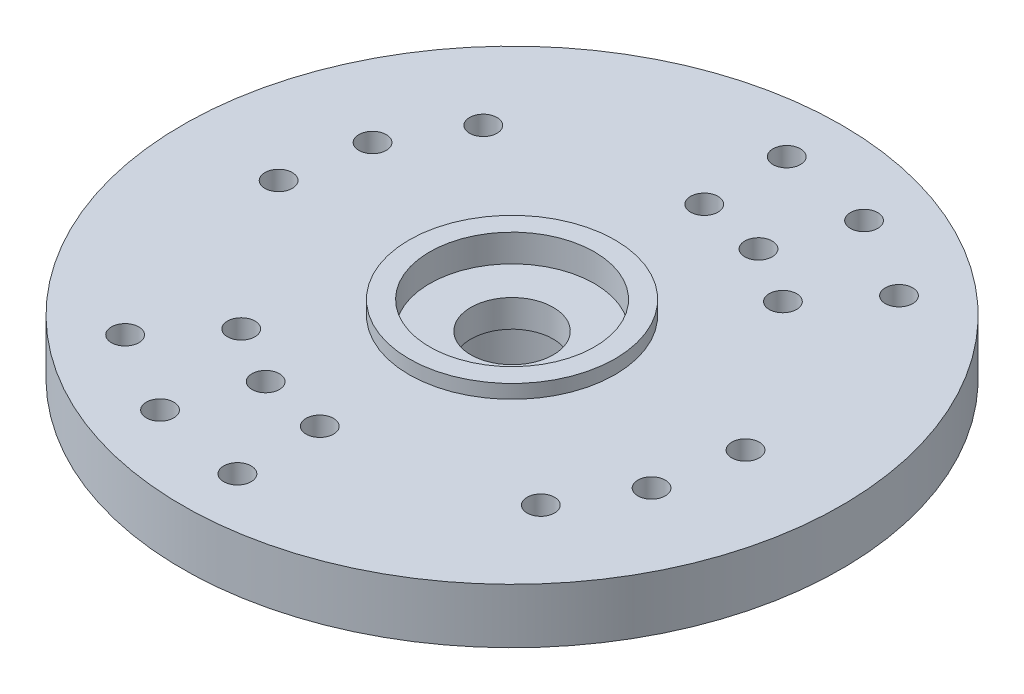
ISO-10303-21;
HEADER;
FILE_DESCRIPTION(('STEP AP214'),'2;1');
FILE_NAME('part.step','',(''),(''),'','','');
FILE_SCHEMA(('AUTOMOTIVE_DESIGN { 1 0 10303 214 1 1 1 1 }'));
ENDSEC;
DATA;
#1=APPLICATION_CONTEXT('core data for automotive mechanical design processes');
#2=APPLICATION_PROTOCOL_DEFINITION('international standard','automotive_design',2000,#1);
#3=PRODUCT_CONTEXT('',#1,'mechanical');
#4=PRODUCT('Part','Part','',(#3));
#5=PRODUCT_RELATED_PRODUCT_CATEGORY('part','',(#4));
#6=PRODUCT_DEFINITION_FORMATION('','',#4);
#7=PRODUCT_DEFINITION_CONTEXT('part definition',#1,'design');
#8=PRODUCT_DEFINITION('design','',#6,#7);
#9=PRODUCT_DEFINITION_SHAPE('','',#8);
#10=(LENGTH_UNIT() NAMED_UNIT(*) SI_UNIT(.MILLI.,.METRE.));
#11=(NAMED_UNIT(*) PLANE_ANGLE_UNIT() SI_UNIT($,.RADIAN.));
#12=(NAMED_UNIT(*) SI_UNIT($,.STERADIAN.) SOLID_ANGLE_UNIT());
#13=UNCERTAINTY_MEASURE_WITH_UNIT(LENGTH_MEASURE(1.E-05),#10,'distance_accuracy_value','');
#14=(GEOMETRIC_REPRESENTATION_CONTEXT(3) GLOBAL_UNCERTAINTY_ASSIGNED_CONTEXT((#13)) GLOBAL_UNIT_ASSIGNED_CONTEXT((#10,
#11,#12)) REPRESENTATION_CONTEXT('',''));
#15=CARTESIAN_POINT('',(0.,0.,0.));
#16=DIRECTION('',(0.,0.,1.));
#17=DIRECTION('',(1.,0.,0.));
#18=AXIS2_PLACEMENT_3D('',#15,#16,#17);
#19=CARTESIAN_POINT('',(4.5,0.,0.));
#20=DIRECTION('',(0.,-1.,0.));
#21=DIRECTION('',(0.,0.,-1.));
#22=AXIS2_PLACEMENT_3D('',#19,#20,#21);
#23=PLANE('',#22);
#24=CARTESIAN_POINT('',(0.,0.,0.));
#25=DIRECTION('',(0.,-1.,0.));
#26=DIRECTION('',(0.,0.,-1.));
#27=AXIS2_PLACEMENT_3D('',#24,#25,#26);
#28=CIRCLE('',#27,4.5);
#29=CARTESIAN_POINT('',(0.,0.,-4.5));
#30=VERTEX_POINT('',#29);
#31=EDGE_CURVE('E51',#30,#30,#28,.T.);
#32=ORIENTED_EDGE('',*,*,#31,.T.);
#33=EDGE_LOOP('',(#32));
#34=FACE_BOUND('',#33,.T.);
#35=CARTESIAN_POINT('',(0.,0.,0.));
#36=DIRECTION('',(0.,-1.,0.));
#37=DIRECTION('',(0.,0.,-1.));
#38=AXIS2_PLACEMENT_3D('',#35,#36,#37);
#39=CIRCLE('',#38,2.75);
#40=CARTESIAN_POINT('',(0.,0.,-2.75));
#41=VERTEX_POINT('',#40);
#42=EDGE_CURVE('E10',#41,#41,#39,.T.);
#43=ORIENTED_EDGE('',*,*,#42,.F.);
#44=EDGE_LOOP('',(#43));
#45=FACE_BOUND('',#44,.T.);
#46=ADVANCED_FACE('F32',(#34,#45),#23,.T.);
#47=CARTESIAN_POINT('',(0.,0.,0.));
#48=DIRECTION('',(0.,-1.,0.));
#49=DIRECTION('',(0.,0.,-1.));
#50=AXIS2_PLACEMENT_3D('',#47,#48,#49);
#51=CYLINDRICAL_SURFACE('',#50,2.75);
#52=ORIENTED_EDGE('',*,*,#42,.T.);
#53=EDGE_LOOP('',(#52));
#54=FACE_BOUND('',#53,.T.);
#55=CARTESIAN_POINT('',(0.,3.,0.));
#56=DIRECTION('',(0.,-1.,0.));
#57=DIRECTION('',(0.,0.,-1.));
#58=AXIS2_PLACEMENT_3D('',#55,#56,#57);
#59=CIRCLE('',#58,2.75);
#60=CARTESIAN_POINT('',(0.,3.,-2.75));
#61=VERTEX_POINT('',#60);
#62=EDGE_CURVE('E39',#61,#61,#59,.T.);
#63=ORIENTED_EDGE('',*,*,#62,.F.);
#64=EDGE_LOOP('',(#63));
#65=FACE_BOUND('',#64,.T.);
#66=ADVANCED_FACE('F190',(#54,#65),#51,.F.);
#67=CARTESIAN_POINT('',(2.75,3.,0.));
#68=DIRECTION('',(0.,-1.,0.));
#69=DIRECTION('',(0.,0.,-1.));
#70=AXIS2_PLACEMENT_3D('',#67,#68,#69);
#71=PLANE('',#70);
#72=ORIENTED_EDGE('',*,*,#62,.T.);
#73=EDGE_LOOP('',(#72));
#74=FACE_BOUND('',#73,.T.);
#75=CARTESIAN_POINT('',(0.,3.,0.));
#76=DIRECTION('',(0.,-1.,0.));
#77=DIRECTION('',(0.,0.,-1.));
#78=AXIS2_PLACEMENT_3D('',#75,#76,#77);
#79=CIRCLE('',#78,1.5);
#80=CARTESIAN_POINT('',(0.,3.,-1.5));
#81=VERTEX_POINT('',#80);
#82=EDGE_CURVE('E44',#81,#81,#79,.T.);
#83=ORIENTED_EDGE('',*,*,#82,.F.);
#84=EDGE_LOOP('',(#83));
#85=FACE_BOUND('',#84,.T.);
#86=ADVANCED_FACE('F188',(#74,#85),#71,.T.);
#87=CARTESIAN_POINT('',(0.,0.,0.));
#88=DIRECTION('',(0.,-1.,0.));
#89=DIRECTION('',(0.,0.,-1.));
#90=AXIS2_PLACEMENT_3D('',#87,#88,#89);
#91=CYLINDRICAL_SURFACE('',#90,1.5);
#92=ORIENTED_EDGE('',*,*,#82,.T.);
#93=EDGE_LOOP('',(#92));
#94=FACE_BOUND('',#93,.T.);
#95=CARTESIAN_POINT('',(0.,4.,0.));
#96=DIRECTION('',(0.,-1.,0.));
#97=DIRECTION('',(0.,0.,-1.));
#98=AXIS2_PLACEMENT_3D('',#95,#96,#97);
#99=CIRCLE('',#98,1.5);
#100=CARTESIAN_POINT('',(0.,4.,-1.5));
#101=VERTEX_POINT('',#100);
#102=EDGE_CURVE('E180',#101,#101,#99,.T.);
#103=ORIENTED_EDGE('',*,*,#102,.F.);
#104=EDGE_LOOP('',(#103));
#105=FACE_BOUND('',#104,.T.);
#106=ADVANCED_FACE('F185',(#94,#105),#91,.F.);
#107=CARTESIAN_POINT('',(1.5,4.,0.));
#108=DIRECTION('',(0.,1.,0.));
#109=DIRECTION('',(0.,0.,1.));
#110=AXIS2_PLACEMENT_3D('',#107,#108,#109);
#111=PLANE('',#110);
#112=ORIENTED_EDGE('',*,*,#102,.T.);
#113=EDGE_LOOP('',(#112));
#114=FACE_BOUND('',#113,.T.);
#115=CARTESIAN_POINT('',(0.,4.,0.));
#116=DIRECTION('',(0.,-1.,0.));
#117=DIRECTION('',(0.,0.,-1.));
#118=AXIS2_PLACEMENT_3D('',#115,#116,#117);
#119=CIRCLE('',#118,3.);
#120=CARTESIAN_POINT('',(0.,4.,-3.));
#121=VERTEX_POINT('',#120);
#122=EDGE_CURVE('E177',#121,#121,#119,.T.);
#123=ORIENTED_EDGE('',*,*,#122,.F.);
#124=EDGE_LOOP('',(#123));
#125=FACE_BOUND('',#124,.T.);
#126=ADVANCED_FACE('F197',(#114,#125),#111,.T.);
#127=CARTESIAN_POINT('',(0.,0.,0.));
#128=DIRECTION('',(0.,-1.,0.));
#129=DIRECTION('',(0.,0.,-1.));
#130=AXIS2_PLACEMENT_3D('',#127,#128,#129);
#131=CYLINDRICAL_SURFACE('',#130,3.);
#132=ORIENTED_EDGE('',*,*,#122,.T.);
#133=EDGE_LOOP('',(#132));
#134=FACE_BOUND('',#133,.T.);
#135=CARTESIAN_POINT('',(0.,5.,0.));
#136=DIRECTION('',(0.,-1.,0.));
#137=DIRECTION('',(0.,0.,-1.));
#138=AXIS2_PLACEMENT_3D('',#135,#136,#137);
#139=CIRCLE('',#138,3.);
#140=CARTESIAN_POINT('',(0.,5.,-3.));
#141=VERTEX_POINT('',#140);
#142=EDGE_CURVE('E174',#141,#141,#139,.T.);
#143=ORIENTED_EDGE('',*,*,#142,.F.);
#144=EDGE_LOOP('',(#143));
#145=FACE_BOUND('',#144,.T.);
#146=ADVANCED_FACE('F238',(#134,#145),#131,.F.);
#147=CARTESIAN_POINT('',(3.,5.,0.));
#148=DIRECTION('',(0.,1.,0.));
#149=DIRECTION('',(0.,0.,1.));
#150=AXIS2_PLACEMENT_3D('',#147,#148,#149);
#151=PLANE('',#150);
#152=ORIENTED_EDGE('',*,*,#142,.T.);
#153=EDGE_LOOP('',(#152));
#154=FACE_BOUND('',#153,.T.);
#155=CARTESIAN_POINT('',(0.,5.,0.));
#156=DIRECTION('',(0.,-1.,0.));
#157=DIRECTION('',(0.,0.,-1.));
#158=AXIS2_PLACEMENT_3D('',#155,#156,#157);
#159=CIRCLE('',#158,3.75);
#160=CARTESIAN_POINT('',(0.,5.,-3.75));
#161=VERTEX_POINT('',#160);
#162=EDGE_CURVE('E171',#161,#161,#159,.T.);
#163=ORIENTED_EDGE('',*,*,#162,.F.);
#164=EDGE_LOOP('',(#163));
#165=FACE_BOUND('',#164,.T.);
#166=ADVANCED_FACE('F234',(#154,#165),#151,.T.);
#167=CARTESIAN_POINT('',(0.,0.,0.));
#168=DIRECTION('',(0.,-1.,0.));
#169=DIRECTION('',(0.,0.,-1.));
#170=AXIS2_PLACEMENT_3D('',#167,#168,#169);
#171=CYLINDRICAL_SURFACE('',#170,3.75);
#172=ORIENTED_EDGE('',*,*,#162,.T.);
#173=EDGE_LOOP('',(#172));
#174=FACE_BOUND('',#173,.T.);
#175=CARTESIAN_POINT('',(0.,4.5,0.));
#176=DIRECTION('',(0.,-1.,0.));
#177=DIRECTION('',(0.,0.,-1.));
#178=AXIS2_PLACEMENT_3D('',#175,#176,#177);
#179=CIRCLE('',#178,3.75);
#180=CARTESIAN_POINT('',(0.,4.5,-3.75));
#181=VERTEX_POINT('',#180);
#182=EDGE_CURVE('E168',#181,#181,#179,.T.);
#183=ORIENTED_EDGE('',*,*,#182,.F.);
#184=EDGE_LOOP('',(#183));
#185=FACE_BOUND('',#184,.T.);
#186=ADVANCED_FACE('F230',(#174,#185),#171,.T.);
#187=CARTESIAN_POINT('',(3.75,4.5,0.));
#188=DIRECTION('',(0.,1.,0.));
#189=DIRECTION('',(0.,0.,1.));
#190=AXIS2_PLACEMENT_3D('',#187,#188,#189);
#191=PLANE('',#190);
#192=CARTESIAN_POINT('',(-6.51137776651131,4.5,-5.46369468233559));
#193=DIRECTION('',(0.,1.,0.));
#194=DIRECTION('',(0.642787609686541,0.,-0.766044443118977));
#195=AXIS2_PLACEMENT_3D('',#192,#193,#194);
#196=CIRCLE('',#195,0.500000000000001);
#197=CARTESIAN_POINT('',(-6.18998396166804,4.5,-5.84671690389508));
#198=VERTEX_POINT('',#197);
#199=EDGE_CURVE('E124',#198,#198,#196,.T.);
#200=ORIENTED_EDGE('',*,*,#199,.F.);
#201=EDGE_LOOP('',(#200));
#202=FACE_BOUND('',#201,.T.);
#203=CARTESIAN_POINT('',(-6.42787609686541,4.5,7.66044443118977));
#204=DIRECTION('',(0.,1.,0.));
#205=DIRECTION('',(0.642787609686541,0.,-0.766044443118977));
#206=AXIS2_PLACEMENT_3D('',#203,#204,#205);
#207=CIRCLE('',#206,0.5);
#208=CARTESIAN_POINT('',(-6.10648229202214,4.5,7.27742220963028));
#209=VERTEX_POINT('',#208);
#210=EDGE_CURVE('E114',#209,#209,#207,.T.);
#211=ORIENTED_EDGE('',*,*,#210,.F.);
#212=EDGE_LOOP('',(#211));
#213=FACE_BOUND('',#212,.T.);
#214=CARTESIAN_POINT('',(-4.49951326780578,4.5,5.36231110183284));
#215=DIRECTION('',(0.,1.,0.));
#216=DIRECTION('',(0.642787609686541,0.,-0.766044443118977));
#217=AXIS2_PLACEMENT_3D('',#214,#215,#216);
#218=CIRCLE('',#217,0.5);
#219=CARTESIAN_POINT('',(-4.17811946296251,4.5,4.97928888027335));
#220=VERTEX_POINT('',#219);
#221=EDGE_CURVE('E111',#220,#220,#218,.T.);
#222=ORIENTED_EDGE('',*,*,#221,.F.);
#223=EDGE_LOOP('',(#222));
#224=FACE_BOUND('',#223,.T.);
#225=CARTESIAN_POINT('',(4.49951326780578,4.5,-5.36231110183284));
#226=DIRECTION('',(0.,1.,0.));
#227=DIRECTION('',(-0.642787609686541,0.,0.766044443118977));
#228=AXIS2_PLACEMENT_3D('',#225,#226,#227);
#229=CIRCLE('',#228,0.5);
#230=CARTESIAN_POINT('',(4.17811946296251,4.5,-4.97928888027335));
#231=VERTEX_POINT('',#230);
#232=EDGE_CURVE('E108',#231,#231,#229,.T.);
#233=ORIENTED_EDGE('',*,*,#232,.F.);
#234=EDGE_LOOP('',(#233));
#235=FACE_BOUND('',#234,.T.);
#236=CARTESIAN_POINT('',(6.51137776651131,4.5,5.4636946823356));
#237=DIRECTION('',(0.,1.,0.));
#238=DIRECTION('',(-0.642787609686541,0.,0.766044443118977));
#239=AXIS2_PLACEMENT_3D('',#236,#237,#238);
#240=CIRCLE('',#239,0.500000000000001);
#241=CARTESIAN_POINT('',(6.18998396166804,4.5,5.84671690389509));
#242=VERTEX_POINT('',#241);
#243=EDGE_CURVE('E104',#242,#242,#240,.T.);
#244=ORIENTED_EDGE('',*,*,#243,.F.);
#245=EDGE_LOOP('',(#244));
#246=FACE_BOUND('',#245,.T.);
#247=CARTESIAN_POINT('',(6.42787609686541,4.5,-7.66044443118977));
#248=DIRECTION('',(0.,1.,0.));
#249=DIRECTION('',(-0.642787609686541,0.,0.766044443118977));
#250=AXIS2_PLACEMENT_3D('',#247,#248,#249);
#251=CIRCLE('',#250,0.5);
#252=CARTESIAN_POINT('',(6.10648229202214,4.5,-7.27742220963028));
#253=VERTEX_POINT('',#252);
#254=EDGE_CURVE('E100',#253,#253,#251,.T.);
#255=ORIENTED_EDGE('',*,*,#254,.F.);
#256=EDGE_LOOP('',(#255));
#257=FACE_BOUND('',#256,.T.);
#258=CARTESIAN_POINT('',(-7.98738727668022,4.5,-2.90717121826819));
#259=DIRECTION('',(0.,1.,0.));
#260=DIRECTION('',(0.342020143325669,0.,-0.939692620785908));
#261=AXIS2_PLACEMENT_3D('',#258,#259,#260);
#262=CIRCLE('',#261,0.500000000000001);
#263=CARTESIAN_POINT('',(-7.81637720501738,4.5,-3.37701752866114));
#264=VERTEX_POINT('',#263);
#265=EDGE_CURVE('E96',#264,#264,#262,.T.);
#266=ORIENTED_EDGE('',*,*,#265,.F.);
#267=EDGE_LOOP('',(#266));
#268=FACE_BOUND('',#267,.T.);
#269=CARTESIAN_POINT('',(-3.42020143325669,4.5,9.39692620785908));
#270=DIRECTION('',(0.,1.,0.));
#271=DIRECTION('',(0.342020143325669,0.,-0.939692620785908));
#272=AXIS2_PLACEMENT_3D('',#269,#270,#271);
#273=CIRCLE('',#272,0.5);
#274=CARTESIAN_POINT('',(-3.24919136159386,4.5,8.92707989746613));
#275=VERTEX_POINT('',#274);
#276=EDGE_CURVE('E92',#275,#275,#273,.T.);
#277=ORIENTED_EDGE('',*,*,#276,.F.);
#278=EDGE_LOOP('',(#277));
#279=FACE_BOUND('',#278,.T.);
#280=CARTESIAN_POINT('',(-2.39414100327969,4.5,6.57784834550136));
#281=DIRECTION('',(0.,1.,0.));
#282=DIRECTION('',(0.342020143325669,0.,-0.939692620785908));
#283=AXIS2_PLACEMENT_3D('',#280,#281,#282);
#284=CIRCLE('',#283,0.5);
#285=CARTESIAN_POINT('',(-2.22313093161685,4.5,6.1080020351084));
#286=VERTEX_POINT('',#285);
#287=EDGE_CURVE('E88',#286,#286,#284,.T.);
#288=ORIENTED_EDGE('',*,*,#287,.F.);
#289=EDGE_LOOP('',(#288));
#290=FACE_BOUND('',#289,.T.);
#291=CARTESIAN_POINT('',(2.39414100327969,4.5,-6.57784834550136));
#292=DIRECTION('',(0.,1.,0.));
#293=DIRECTION('',(-0.342020143325669,0.,0.939692620785908));
#294=AXIS2_PLACEMENT_3D('',#291,#292,#293);
#295=CIRCLE('',#294,0.5);
#296=CARTESIAN_POINT('',(2.22313093161685,4.5,-6.1080020351084));
#297=VERTEX_POINT('',#296);
#298=EDGE_CURVE('E84',#297,#297,#295,.T.);
#299=ORIENTED_EDGE('',*,*,#298,.F.);
#300=EDGE_LOOP('',(#299));
#301=FACE_BOUND('',#300,.T.);
#302=CARTESIAN_POINT('',(7.98738727668022,4.5,2.90717121826819));
#303=DIRECTION('',(0.,1.,0.));
#304=DIRECTION('',(-0.342020143325669,0.,0.939692620785908));
#305=AXIS2_PLACEMENT_3D('',#302,#303,#304);
#306=CIRCLE('',#305,0.500000000000001);
#307=CARTESIAN_POINT('',(7.81637720501739,4.5,3.37701752866115));
#308=VERTEX_POINT('',#307);
#309=EDGE_CURVE('E80',#308,#308,#306,.T.);
#310=ORIENTED_EDGE('',*,*,#309,.F.);
#311=EDGE_LOOP('',(#310));
#312=FACE_BOUND('',#311,.T.);
#313=CARTESIAN_POINT('',(3.42020143325669,4.5,-9.39692620785908));
#314=DIRECTION('',(0.,1.,0.));
#315=DIRECTION('',(-0.342020143325669,0.,0.939692620785908));
#316=AXIS2_PLACEMENT_3D('',#313,#314,#315);
#317=CIRCLE('',#316,0.5);
#318=CARTESIAN_POINT('',(3.24919136159386,4.5,-8.92707989746613));
#319=VERTEX_POINT('',#318);
#320=EDGE_CURVE('E76',#319,#319,#317,.T.);
#321=ORIENTED_EDGE('',*,*,#320,.F.);
#322=EDGE_LOOP('',(#321));
#323=FACE_BOUND('',#322,.T.);
#324=CARTESIAN_POINT('',(-8.5,4.5,0.));
#325=DIRECTION('',(0.,1.,0.));
#326=DIRECTION('',(0.,0.,-1.));
#327=AXIS2_PLACEMENT_3D('',#324,#325,#326);
#328=CIRCLE('',#327,0.500000000000001);
#329=CARTESIAN_POINT('',(-8.5,4.5,-0.499999999999999));
#330=VERTEX_POINT('',#329);
#331=EDGE_CURVE('E72',#330,#330,#328,.T.);
#332=ORIENTED_EDGE('',*,*,#331,.F.);
#333=EDGE_LOOP('',(#332));
#334=FACE_BOUND('',#333,.T.);
#335=CARTESIAN_POINT('',(0.,4.5,10.));
#336=DIRECTION('',(0.,1.,0.));
#337=DIRECTION('',(0.,0.,-1.));
#338=AXIS2_PLACEMENT_3D('',#335,#336,#337);
#339=CIRCLE('',#338,0.5);
#340=CARTESIAN_POINT('',(0.,4.5,9.5));
#341=VERTEX_POINT('',#340);
#342=EDGE_CURVE('E68',#341,#341,#339,.T.);
#343=ORIENTED_EDGE('',*,*,#342,.F.);
#344=EDGE_LOOP('',(#343));
#345=FACE_BOUND('',#344,.T.);
#346=CARTESIAN_POINT('',(0.,4.5,7.));
#347=DIRECTION('',(0.,1.,0.));
#348=DIRECTION('',(0.,0.,-1.));
#349=AXIS2_PLACEMENT_3D('',#346,#347,#348);
#350=CIRCLE('',#349,0.5);
#351=CARTESIAN_POINT('',(0.,4.5,6.5));
#352=VERTEX_POINT('',#351);
#353=EDGE_CURVE('E64',#352,#352,#350,.T.);
#354=ORIENTED_EDGE('',*,*,#353,.F.);
#355=EDGE_LOOP('',(#354));
#356=FACE_BOUND('',#355,.T.);
#357=CARTESIAN_POINT('',(0.,4.5,-7.));
#358=DIRECTION('',(0.,1.,0.));
#359=DIRECTION('',(0.,0.,1.));
#360=AXIS2_PLACEMENT_3D('',#357,#358,#359);
#361=CIRCLE('',#360,0.5);
#362=CARTESIAN_POINT('',(0.,4.5,-6.5));
#363=VERTEX_POINT('',#362);
#364=EDGE_CURVE('E60',#363,#363,#361,.T.);
#365=ORIENTED_EDGE('',*,*,#364,.F.);
#366=EDGE_LOOP('',(#365));
#367=FACE_BOUND('',#366,.T.);
#368=CARTESIAN_POINT('',(8.5,4.5,0.));
#369=DIRECTION('',(0.,1.,0.));
#370=DIRECTION('',(0.,0.,1.));
#371=AXIS2_PLACEMENT_3D('',#368,#369,#370);
#372=CIRCLE('',#371,0.500000000000001);
#373=CARTESIAN_POINT('',(8.5,4.5,0.500000000000001));
#374=VERTEX_POINT('',#373);
#375=EDGE_CURVE('E56',#374,#374,#372,.T.);
#376=ORIENTED_EDGE('',*,*,#375,.F.);
#377=EDGE_LOOP('',(#376));
#378=FACE_BOUND('',#377,.T.);
#379=CARTESIAN_POINT('',(0.,4.5,-10.));
#380=DIRECTION('',(0.,1.,0.));
#381=DIRECTION('',(0.,0.,1.));
#382=AXIS2_PLACEMENT_3D('',#379,#380,#381);
#383=CIRCLE('',#382,0.5);
#384=CARTESIAN_POINT('',(0.,4.5,-9.5));
#385=VERTEX_POINT('',#384);
#386=EDGE_CURVE('E52',#385,#385,#383,.T.);
#387=ORIENTED_EDGE('',*,*,#386,.F.);
#388=EDGE_LOOP('',(#387));
#389=FACE_BOUND('',#388,.T.);
#390=ORIENTED_EDGE('',*,*,#182,.T.);
#391=EDGE_LOOP('',(#390));
#392=FACE_BOUND('',#391,.T.);
#393=CARTESIAN_POINT('',(0.,4.5,0.));
#394=DIRECTION('',(0.,-1.,0.));
#395=DIRECTION('',(0.,0.,-1.));
#396=AXIS2_PLACEMENT_3D('',#393,#394,#395);
#397=CIRCLE('',#396,12.);
#398=CARTESIAN_POINT('',(0.,4.5,-12.));
#399=VERTEX_POINT('',#398);
#400=EDGE_CURVE('E165',#399,#399,#397,.T.);
#401=ORIENTED_EDGE('',*,*,#400,.F.);
#402=EDGE_LOOP('',(#401));
#403=FACE_BOUND('',#402,.T.);
#404=ADVANCED_FACE('F226',(#202,#213,#224,#235,#246,#257,#268,#279,#290,#301,#312,#323,#334,
#345,#356,#367,#378,#389,#392,#403),#191,.T.);
#405=CARTESIAN_POINT('',(0.,0.,0.));
#406=DIRECTION('',(0.,-1.,0.));
#407=DIRECTION('',(0.,0.,-1.));
#408=AXIS2_PLACEMENT_3D('',#405,#406,#407);
#409=CYLINDRICAL_SURFACE('',#408,12.);
#410=ORIENTED_EDGE('',*,*,#400,.T.);
#411=EDGE_LOOP('',(#410));
#412=FACE_BOUND('',#411,.T.);
#413=CARTESIAN_POINT('',(0.,2.5,0.));
#414=DIRECTION('',(0.,-1.,0.));
#415=DIRECTION('',(0.,0.,-1.));
#416=AXIS2_PLACEMENT_3D('',#413,#414,#415);
#417=CIRCLE('',#416,12.);
#418=CARTESIAN_POINT('',(0.,2.5,-12.));
#419=VERTEX_POINT('',#418);
#420=EDGE_CURVE('E162',#419,#419,#417,.T.);
#421=ORIENTED_EDGE('',*,*,#420,.F.);
#422=EDGE_LOOP('',(#421));
#423=FACE_BOUND('',#422,.T.);
#424=ADVANCED_FACE('F219',(#412,#423),#409,.T.);
#425=CARTESIAN_POINT('',(12.,2.5,0.));
#426=DIRECTION('',(0.,-1.,0.));
#427=DIRECTION('',(0.,0.,-1.));
#428=AXIS2_PLACEMENT_3D('',#425,#426,#427);
#429=PLANE('',#428);
#430=CARTESIAN_POINT('',(-6.51137776651131,2.5,-5.46369468233559));
#431=DIRECTION('',(0.,-1.,0.));
#432=DIRECTION('',(0.,0.,-1.));
#433=AXIS2_PLACEMENT_3D('',#430,#431,#432);
#434=CIRCLE('',#433,0.500000000000001);
#435=CARTESIAN_POINT('',(-6.51137776651131,2.5,-5.96369468233559));
#436=VERTEX_POINT('',#435);
#437=EDGE_CURVE('E35',#436,#436,#434,.T.);
#438=ORIENTED_EDGE('',*,*,#437,.F.);
#439=EDGE_LOOP('',(#438));
#440=FACE_BOUND('',#439,.T.);
#441=CARTESIAN_POINT('',(-6.42787609686541,2.5,7.66044443118977));
#442=DIRECTION('',(0.,-1.,0.));
#443=DIRECTION('',(0.,0.,-1.));
#444=AXIS2_PLACEMENT_3D('',#441,#442,#443);
#445=CIRCLE('',#444,0.5);
#446=CARTESIAN_POINT('',(-6.42787609686541,2.5,7.16044443118977));
#447=VERTEX_POINT('',#446);
#448=EDGE_CURVE('E112',#447,#447,#445,.T.);
#449=ORIENTED_EDGE('',*,*,#448,.F.);
#450=EDGE_LOOP('',(#449));
#451=FACE_BOUND('',#450,.T.);
#452=CARTESIAN_POINT('',(-4.49951326780578,2.5,5.36231110183284));
#453=DIRECTION('',(0.,-1.,0.));
#454=DIRECTION('',(0.,0.,-1.));
#455=AXIS2_PLACEMENT_3D('',#452,#453,#454);
#456=CIRCLE('',#455,0.5);
#457=CARTESIAN_POINT('',(-4.49951326780578,2.5,4.86231110183284));
#458=VERTEX_POINT('',#457);
#459=EDGE_CURVE('E109',#458,#458,#456,.T.);
#460=ORIENTED_EDGE('',*,*,#459,.F.);
#461=EDGE_LOOP('',(#460));
#462=FACE_BOUND('',#461,.T.);
#463=CARTESIAN_POINT('',(4.49951326780578,2.5,-5.36231110183284));
#464=DIRECTION('',(0.,-1.,0.));
#465=DIRECTION('',(0.,0.,-1.));
#466=AXIS2_PLACEMENT_3D('',#463,#464,#465);
#467=CIRCLE('',#466,0.5);
#468=CARTESIAN_POINT('',(4.49951326780578,2.5,-5.86231110183284));
#469=VERTEX_POINT('',#468);
#470=EDGE_CURVE('E105',#469,#469,#467,.T.);
#471=ORIENTED_EDGE('',*,*,#470,.F.);
#472=EDGE_LOOP('',(#471));
#473=FACE_BOUND('',#472,.T.);
#474=CARTESIAN_POINT('',(6.51137776651131,2.5,5.4636946823356));
#475=DIRECTION('',(0.,-1.,0.));
#476=DIRECTION('',(0.,0.,-1.));
#477=AXIS2_PLACEMENT_3D('',#474,#475,#476);
#478=CIRCLE('',#477,0.500000000000001);
#479=CARTESIAN_POINT('',(6.51137776651131,2.5,4.9636946823356));
#480=VERTEX_POINT('',#479);
#481=EDGE_CURVE('E101',#480,#480,#478,.T.);
#482=ORIENTED_EDGE('',*,*,#481,.F.);
#483=EDGE_LOOP('',(#482));
#484=FACE_BOUND('',#483,.T.);
#485=CARTESIAN_POINT('',(6.42787609686541,2.5,-7.66044443118977));
#486=DIRECTION('',(0.,-1.,0.));
#487=DIRECTION('',(0.,0.,-1.));
#488=AXIS2_PLACEMENT_3D('',#485,#486,#487);
#489=CIRCLE('',#488,0.5);
#490=CARTESIAN_POINT('',(6.42787609686541,2.5,-8.16044443118977));
#491=VERTEX_POINT('',#490);
#492=EDGE_CURVE('E97',#491,#491,#489,.T.);
#493=ORIENTED_EDGE('',*,*,#492,.F.);
#494=EDGE_LOOP('',(#493));
#495=FACE_BOUND('',#494,.T.);
#496=CARTESIAN_POINT('',(-7.98738727668022,2.5,-2.90717121826819));
#497=DIRECTION('',(0.,-1.,0.));
#498=DIRECTION('',(0.,0.,-1.));
#499=AXIS2_PLACEMENT_3D('',#496,#497,#498);
#500=CIRCLE('',#499,0.500000000000001);
#501=CARTESIAN_POINT('',(-7.98738727668022,2.5,-3.40717121826819));
#502=VERTEX_POINT('',#501);
#503=EDGE_CURVE('E93',#502,#502,#500,.T.);
#504=ORIENTED_EDGE('',*,*,#503,.F.);
#505=EDGE_LOOP('',(#504));
#506=FACE_BOUND('',#505,.T.);
#507=CARTESIAN_POINT('',(-3.42020143325669,2.5,9.39692620785908));
#508=DIRECTION('',(0.,-1.,0.));
#509=DIRECTION('',(0.,0.,-1.));
#510=AXIS2_PLACEMENT_3D('',#507,#508,#509);
#511=CIRCLE('',#510,0.5);
#512=CARTESIAN_POINT('',(-3.42020143325669,2.5,8.89692620785908));
#513=VERTEX_POINT('',#512);
#514=EDGE_CURVE('E89',#513,#513,#511,.T.);
#515=ORIENTED_EDGE('',*,*,#514,.F.);
#516=EDGE_LOOP('',(#515));
#517=FACE_BOUND('',#516,.T.);
#518=CARTESIAN_POINT('',(-2.39414100327969,2.5,6.57784834550136));
#519=DIRECTION('',(0.,-1.,0.));
#520=DIRECTION('',(0.,0.,-1.));
#521=AXIS2_PLACEMENT_3D('',#518,#519,#520);
#522=CIRCLE('',#521,0.5);
#523=CARTESIAN_POINT('',(-2.39414100327969,2.5,6.07784834550136));
#524=VERTEX_POINT('',#523);
#525=EDGE_CURVE('E85',#524,#524,#522,.T.);
#526=ORIENTED_EDGE('',*,*,#525,.F.);
#527=EDGE_LOOP('',(#526));
#528=FACE_BOUND('',#527,.T.);
#529=CARTESIAN_POINT('',(2.39414100327969,2.5,-6.57784834550136));
#530=DIRECTION('',(0.,-1.,0.));
#531=DIRECTION('',(0.,0.,-1.));
#532=AXIS2_PLACEMENT_3D('',#529,#530,#531);
#533=CIRCLE('',#532,0.5);
#534=CARTESIAN_POINT('',(2.39414100327969,2.5,-7.07784834550136));
#535=VERTEX_POINT('',#534);
#536=EDGE_CURVE('E81',#535,#535,#533,.T.);
#537=ORIENTED_EDGE('',*,*,#536,.F.);
#538=EDGE_LOOP('',(#537));
#539=FACE_BOUND('',#538,.T.);
#540=CARTESIAN_POINT('',(7.98738727668022,2.5,2.90717121826819));
#541=DIRECTION('',(0.,-1.,0.));
#542=DIRECTION('',(0.,0.,-1.));
#543=AXIS2_PLACEMENT_3D('',#540,#541,#542);
#544=CIRCLE('',#543,0.500000000000001);
#545=CARTESIAN_POINT('',(7.98738727668022,2.5,2.40717121826819));
#546=VERTEX_POINT('',#545);
#547=EDGE_CURVE('E77',#546,#546,#544,.T.);
#548=ORIENTED_EDGE('',*,*,#547,.F.);
#549=EDGE_LOOP('',(#548));
#550=FACE_BOUND('',#549,.T.);
#551=CARTESIAN_POINT('',(3.42020143325669,2.5,-9.39692620785908));
#552=DIRECTION('',(0.,-1.,0.));
#553=DIRECTION('',(0.,0.,-1.));
#554=AXIS2_PLACEMENT_3D('',#551,#552,#553);
#555=CIRCLE('',#554,0.5);
#556=CARTESIAN_POINT('',(3.42020143325669,2.5,-9.89692620785908));
#557=VERTEX_POINT('',#556);
#558=EDGE_CURVE('E73',#557,#557,#555,.T.);
#559=ORIENTED_EDGE('',*,*,#558,.F.);
#560=EDGE_LOOP('',(#559));
#561=FACE_BOUND('',#560,.T.);
#562=CARTESIAN_POINT('',(-8.5,2.5,0.));
#563=DIRECTION('',(0.,-1.,0.));
#564=DIRECTION('',(0.,0.,-1.));
#565=AXIS2_PLACEMENT_3D('',#562,#563,#564);
#566=CIRCLE('',#565,0.500000000000001);
#567=CARTESIAN_POINT('',(-8.5,2.5,-0.499999999999999));
#568=VERTEX_POINT('',#567);
#569=EDGE_CURVE('E69',#568,#568,#566,.T.);
#570=ORIENTED_EDGE('',*,*,#569,.F.);
#571=EDGE_LOOP('',(#570));
#572=FACE_BOUND('',#571,.T.);
#573=CARTESIAN_POINT('',(0.,2.5,10.));
#574=DIRECTION('',(0.,-1.,0.));
#575=DIRECTION('',(0.,0.,-1.));
#576=AXIS2_PLACEMENT_3D('',#573,#574,#575);
#577=CIRCLE('',#576,0.5);
#578=CARTESIAN_POINT('',(0.,2.5,9.5));
#579=VERTEX_POINT('',#578);
#580=EDGE_CURVE('E65',#579,#579,#577,.T.);
#581=ORIENTED_EDGE('',*,*,#580,.F.);
#582=EDGE_LOOP('',(#581));
#583=FACE_BOUND('',#582,.T.);
#584=CARTESIAN_POINT('',(0.,2.5,7.));
#585=DIRECTION('',(0.,-1.,0.));
#586=DIRECTION('',(0.,0.,-1.));
#587=AXIS2_PLACEMENT_3D('',#584,#585,#586);
#588=CIRCLE('',#587,0.5);
#589=CARTESIAN_POINT('',(0.,2.5,6.5));
#590=VERTEX_POINT('',#589);
#591=EDGE_CURVE('E61',#590,#590,#588,.T.);
#592=ORIENTED_EDGE('',*,*,#591,.F.);
#593=EDGE_LOOP('',(#592));
#594=FACE_BOUND('',#593,.T.);
#595=CARTESIAN_POINT('',(0.,2.5,-7.));
#596=DIRECTION('',(0.,-1.,0.));
#597=DIRECTION('',(0.,0.,-1.));
#598=AXIS2_PLACEMENT_3D('',#595,#596,#597);
#599=CIRCLE('',#598,0.5);
#600=CARTESIAN_POINT('',(0.,2.5,-7.5));
#601=VERTEX_POINT('',#600);
#602=EDGE_CURVE('E57',#601,#601,#599,.T.);
#603=ORIENTED_EDGE('',*,*,#602,.F.);
#604=EDGE_LOOP('',(#603));
#605=FACE_BOUND('',#604,.T.);
#606=CARTESIAN_POINT('',(8.5,2.5,0.));
#607=DIRECTION('',(0.,-1.,0.));
#608=DIRECTION('',(0.,0.,-1.));
#609=AXIS2_PLACEMENT_3D('',#606,#607,#608);
#610=CIRCLE('',#609,0.500000000000001);
#611=CARTESIAN_POINT('',(8.5,2.5,-0.500000000000001));
#612=VERTEX_POINT('',#611);
#613=EDGE_CURVE('E53',#612,#612,#610,.T.);
#614=ORIENTED_EDGE('',*,*,#613,.F.);
#615=EDGE_LOOP('',(#614));
#616=FACE_BOUND('',#615,.T.);
#617=CARTESIAN_POINT('',(0.,2.5,-10.));
#618=DIRECTION('',(0.,-1.,0.));
#619=DIRECTION('',(0.,0.,-1.));
#620=AXIS2_PLACEMENT_3D('',#617,#618,#619);
#621=CIRCLE('',#620,0.5);
#622=CARTESIAN_POINT('',(0.,2.5,-10.5));
#623=VERTEX_POINT('',#622);
#624=EDGE_CURVE('E48',#623,#623,#621,.T.);
#625=ORIENTED_EDGE('',*,*,#624,.F.);
#626=EDGE_LOOP('',(#625));
#627=FACE_BOUND('',#626,.T.);
#628=ORIENTED_EDGE('',*,*,#420,.T.);
#629=EDGE_LOOP('',(#628));
#630=FACE_BOUND('',#629,.T.);
#631=CARTESIAN_POINT('',(0.,2.5,0.));
#632=DIRECTION('',(0.,-1.,0.));
#633=DIRECTION('',(0.,0.,-1.));
#634=AXIS2_PLACEMENT_3D('',#631,#632,#633);
#635=CIRCLE('',#634,4.5);
#636=CARTESIAN_POINT('',(0.,2.5,-4.5));
#637=VERTEX_POINT('',#636);
#638=EDGE_CURVE('E159',#637,#637,#635,.T.);
#639=ORIENTED_EDGE('',*,*,#638,.F.);
#640=EDGE_LOOP('',(#639));
#641=FACE_BOUND('',#640,.T.);
#642=ADVANCED_FACE('F209',(#440,#451,#462,#473,#484,#495,#506,#517,#528,#539,#550,#561,#572,
#583,#594,#605,#616,#627,#630,#641),#429,.T.);
#643=CARTESIAN_POINT('',(0.,0.,0.));
#644=DIRECTION('',(0.,-1.,0.));
#645=DIRECTION('',(0.,0.,-1.));
#646=AXIS2_PLACEMENT_3D('',#643,#644,#645);
#647=CYLINDRICAL_SURFACE('',#646,4.5);
#648=ORIENTED_EDGE('',*,*,#638,.T.);
#649=EDGE_LOOP('',(#648));
#650=FACE_BOUND('',#649,.T.);
#651=ORIENTED_EDGE('',*,*,#31,.F.);
#652=EDGE_LOOP('',(#651));
#653=FACE_BOUND('',#652,.T.);
#654=ADVANCED_FACE('F206',(#650,#653),#647,.T.);
#655=CARTESIAN_POINT('',(0.,-5.5,-10.));
#656=DIRECTION('',(0.,1.,0.));
#657=DIRECTION('',(0.,0.,1.));
#658=AXIS2_PLACEMENT_3D('',#655,#656,#657);
#659=CYLINDRICAL_SURFACE('',#658,0.5);
#660=ORIENTED_EDGE('',*,*,#624,.T.);
#661=EDGE_LOOP('',(#660));
#662=FACE_BOUND('',#661,.T.);
#663=ORIENTED_EDGE('',*,*,#386,.T.);
#664=EDGE_LOOP('',(#663));
#665=FACE_BOUND('',#664,.T.);
#666=ADVANCED_FACE('F208',(#662,#665),#659,.F.);
#667=CARTESIAN_POINT('',(8.5,-5.5,0.));
#668=DIRECTION('',(0.,1.,0.));
#669=DIRECTION('',(0.,0.,1.));
#670=AXIS2_PLACEMENT_3D('',#667,#668,#669);
#671=CYLINDRICAL_SURFACE('',#670,0.500000000000001);
#672=ORIENTED_EDGE('',*,*,#613,.T.);
#673=EDGE_LOOP('',(#672));
#674=FACE_BOUND('',#673,.T.);
#675=ORIENTED_EDGE('',*,*,#375,.T.);
#676=EDGE_LOOP('',(#675));
#677=FACE_BOUND('',#676,.T.);
#678=ADVANCED_FACE('F216',(#674,#677),#671,.F.);
#679=CARTESIAN_POINT('',(0.,-5.5,-7.));
#680=DIRECTION('',(0.,1.,0.));
#681=DIRECTION('',(0.,0.,1.));
#682=AXIS2_PLACEMENT_3D('',#679,#680,#681);
#683=CYLINDRICAL_SURFACE('',#682,0.5);
#684=ORIENTED_EDGE('',*,*,#602,.T.);
#685=EDGE_LOOP('',(#684));
#686=FACE_BOUND('',#685,.T.);
#687=ORIENTED_EDGE('',*,*,#364,.T.);
#688=EDGE_LOOP('',(#687));
#689=FACE_BOUND('',#688,.T.);
#690=ADVANCED_FACE('F429',(#686,#689),#683,.F.);
#691=CARTESIAN_POINT('',(0.,-5.5,7.));
#692=DIRECTION('',(0.,1.,0.));
#693=DIRECTION('',(0.,0.,1.));
#694=AXIS2_PLACEMENT_3D('',#691,#692,#693);
#695=CYLINDRICAL_SURFACE('',#694,0.5);
#696=ORIENTED_EDGE('',*,*,#591,.T.);
#697=EDGE_LOOP('',(#696));
#698=FACE_BOUND('',#697,.T.);
#699=ORIENTED_EDGE('',*,*,#353,.T.);
#700=EDGE_LOOP('',(#699));
#701=FACE_BOUND('',#700,.T.);
#702=ADVANCED_FACE('F425',(#698,#701),#695,.F.);
#703=CARTESIAN_POINT('',(0.,-5.5,10.));
#704=DIRECTION('',(0.,1.,0.));
#705=DIRECTION('',(0.,0.,1.));
#706=AXIS2_PLACEMENT_3D('',#703,#704,#705);
#707=CYLINDRICAL_SURFACE('',#706,0.5);
#708=ORIENTED_EDGE('',*,*,#580,.T.);
#709=EDGE_LOOP('',(#708));
#710=FACE_BOUND('',#709,.T.);
#711=ORIENTED_EDGE('',*,*,#342,.T.);
#712=EDGE_LOOP('',(#711));
#713=FACE_BOUND('',#712,.T.);
#714=ADVANCED_FACE('F421',(#710,#713),#707,.F.);
#715=CARTESIAN_POINT('',(-8.5,-5.5,0.));
#716=DIRECTION('',(0.,1.,0.));
#717=DIRECTION('',(0.,0.,1.));
#718=AXIS2_PLACEMENT_3D('',#715,#716,#717);
#719=CYLINDRICAL_SURFACE('',#718,0.500000000000001);
#720=ORIENTED_EDGE('',*,*,#569,.T.);
#721=EDGE_LOOP('',(#720));
#722=FACE_BOUND('',#721,.T.);
#723=ORIENTED_EDGE('',*,*,#331,.T.);
#724=EDGE_LOOP('',(#723));
#725=FACE_BOUND('',#724,.T.);
#726=ADVANCED_FACE('F303',(#722,#725),#719,.F.);
#727=CARTESIAN_POINT('',(3.42020143325669,-5.5,-9.39692620785908));
#728=DIRECTION('',(0.,1.,0.));
#729=DIRECTION('',(0.,0.,1.));
#730=AXIS2_PLACEMENT_3D('',#727,#728,#729);
#731=CYLINDRICAL_SURFACE('',#730,0.5);
#732=ORIENTED_EDGE('',*,*,#558,.T.);
#733=EDGE_LOOP('',(#732));
#734=FACE_BOUND('',#733,.T.);
#735=ORIENTED_EDGE('',*,*,#320,.T.);
#736=EDGE_LOOP('',(#735));
#737=FACE_BOUND('',#736,.T.);
#738=ADVANCED_FACE('F297',(#734,#737),#731,.F.);
#739=CARTESIAN_POINT('',(7.98738727668022,-5.5,2.90717121826819));
#740=DIRECTION('',(0.,1.,0.));
#741=DIRECTION('',(0.,0.,1.));
#742=AXIS2_PLACEMENT_3D('',#739,#740,#741);
#743=CYLINDRICAL_SURFACE('',#742,0.500000000000001);
#744=ORIENTED_EDGE('',*,*,#547,.T.);
#745=EDGE_LOOP('',(#744));
#746=FACE_BOUND('',#745,.T.);
#747=ORIENTED_EDGE('',*,*,#309,.T.);
#748=EDGE_LOOP('',(#747));
#749=FACE_BOUND('',#748,.T.);
#750=ADVANCED_FACE('F302',(#746,#749),#743,.F.);
#751=CARTESIAN_POINT('',(2.39414100327969,-5.5,-6.57784834550136));
#752=DIRECTION('',(0.,1.,0.));
#753=DIRECTION('',(0.,0.,1.));
#754=AXIS2_PLACEMENT_3D('',#751,#752,#753);
#755=CYLINDRICAL_SURFACE('',#754,0.5);
#756=ORIENTED_EDGE('',*,*,#536,.T.);
#757=EDGE_LOOP('',(#756));
#758=FACE_BOUND('',#757,.T.);
#759=ORIENTED_EDGE('',*,*,#298,.T.);
#760=EDGE_LOOP('',(#759));
#761=FACE_BOUND('',#760,.T.);
#762=ADVANCED_FACE('F315',(#758,#761),#755,.F.);
#763=CARTESIAN_POINT('',(-2.39414100327969,-5.5,6.57784834550136));
#764=DIRECTION('',(0.,1.,0.));
#765=DIRECTION('',(0.,0.,1.));
#766=AXIS2_PLACEMENT_3D('',#763,#764,#765);
#767=CYLINDRICAL_SURFACE('',#766,0.5);
#768=ORIENTED_EDGE('',*,*,#525,.T.);
#769=EDGE_LOOP('',(#768));
#770=FACE_BOUND('',#769,.T.);
#771=ORIENTED_EDGE('',*,*,#287,.T.);
#772=EDGE_LOOP('',(#771));
#773=FACE_BOUND('',#772,.T.);
#774=ADVANCED_FACE('F325',(#770,#773),#767,.F.);
#775=CARTESIAN_POINT('',(-3.42020143325669,-5.5,9.39692620785908));
#776=DIRECTION('',(0.,1.,0.));
#777=DIRECTION('',(0.,0.,1.));
#778=AXIS2_PLACEMENT_3D('',#775,#776,#777);
#779=CYLINDRICAL_SURFACE('',#778,0.5);
#780=ORIENTED_EDGE('',*,*,#514,.T.);
#781=EDGE_LOOP('',(#780));
#782=FACE_BOUND('',#781,.T.);
#783=ORIENTED_EDGE('',*,*,#276,.T.);
#784=EDGE_LOOP('',(#783));
#785=FACE_BOUND('',#784,.T.);
#786=ADVANCED_FACE('F335',(#782,#785),#779,.F.);
#787=CARTESIAN_POINT('',(-7.98738727668022,-5.5,-2.90717121826819));
#788=DIRECTION('',(0.,1.,0.));
#789=DIRECTION('',(0.,0.,1.));
#790=AXIS2_PLACEMENT_3D('',#787,#788,#789);
#791=CYLINDRICAL_SURFACE('',#790,0.500000000000001);
#792=ORIENTED_EDGE('',*,*,#503,.T.);
#793=EDGE_LOOP('',(#792));
#794=FACE_BOUND('',#793,.T.);
#795=ORIENTED_EDGE('',*,*,#265,.T.);
#796=EDGE_LOOP('',(#795));
#797=FACE_BOUND('',#796,.T.);
#798=ADVANCED_FACE('F345',(#794,#797),#791,.F.);
#799=CARTESIAN_POINT('',(6.42787609686541,-5.5,-7.66044443118977));
#800=DIRECTION('',(0.,1.,0.));
#801=DIRECTION('',(0.,0.,1.));
#802=AXIS2_PLACEMENT_3D('',#799,#800,#801);
#803=CYLINDRICAL_SURFACE('',#802,0.5);
#804=ORIENTED_EDGE('',*,*,#492,.T.);
#805=EDGE_LOOP('',(#804));
#806=FACE_BOUND('',#805,.T.);
#807=ORIENTED_EDGE('',*,*,#254,.T.);
#808=EDGE_LOOP('',(#807));
#809=FACE_BOUND('',#808,.T.);
#810=ADVANCED_FACE('F355',(#806,#809),#803,.F.);
#811=CARTESIAN_POINT('',(6.51137776651131,-5.5,5.4636946823356));
#812=DIRECTION('',(0.,1.,0.));
#813=DIRECTION('',(0.,0.,1.));
#814=AXIS2_PLACEMENT_3D('',#811,#812,#813);
#815=CYLINDRICAL_SURFACE('',#814,0.500000000000001);
#816=ORIENTED_EDGE('',*,*,#481,.T.);
#817=EDGE_LOOP('',(#816));
#818=FACE_BOUND('',#817,.T.);
#819=ORIENTED_EDGE('',*,*,#243,.T.);
#820=EDGE_LOOP('',(#819));
#821=FACE_BOUND('',#820,.T.);
#822=ADVANCED_FACE('F365',(#818,#821),#815,.F.);
#823=CARTESIAN_POINT('',(4.49951326780578,-5.5,-5.36231110183284));
#824=DIRECTION('',(0.,1.,0.));
#825=DIRECTION('',(0.,0.,1.));
#826=AXIS2_PLACEMENT_3D('',#823,#824,#825);
#827=CYLINDRICAL_SURFACE('',#826,0.5);
#828=ORIENTED_EDGE('',*,*,#470,.T.);
#829=EDGE_LOOP('',(#828));
#830=FACE_BOUND('',#829,.T.);
#831=ORIENTED_EDGE('',*,*,#232,.T.);
#832=EDGE_LOOP('',(#831));
#833=FACE_BOUND('',#832,.T.);
#834=ADVANCED_FACE('F375',(#830,#833),#827,.F.);
#835=CARTESIAN_POINT('',(-4.49951326780578,-5.5,5.36231110183284));
#836=DIRECTION('',(0.,1.,0.));
#837=DIRECTION('',(0.,0.,1.));
#838=AXIS2_PLACEMENT_3D('',#835,#836,#837);
#839=CYLINDRICAL_SURFACE('',#838,0.5);
#840=ORIENTED_EDGE('',*,*,#459,.T.);
#841=EDGE_LOOP('',(#840));
#842=FACE_BOUND('',#841,.T.);
#843=ORIENTED_EDGE('',*,*,#221,.T.);
#844=EDGE_LOOP('',(#843));
#845=FACE_BOUND('',#844,.T.);
#846=ADVANCED_FACE('F385',(#842,#845),#839,.F.);
#847=CARTESIAN_POINT('',(-6.42787609686541,-5.5,7.66044443118977));
#848=DIRECTION('',(0.,1.,0.));
#849=DIRECTION('',(0.,0.,1.));
#850=AXIS2_PLACEMENT_3D('',#847,#848,#849);
#851=CYLINDRICAL_SURFACE('',#850,0.5);
#852=ORIENTED_EDGE('',*,*,#448,.T.);
#853=EDGE_LOOP('',(#852));
#854=FACE_BOUND('',#853,.T.);
#855=ORIENTED_EDGE('',*,*,#210,.T.);
#856=EDGE_LOOP('',(#855));
#857=FACE_BOUND('',#856,.T.);
#858=ADVANCED_FACE('F395',(#854,#857),#851,.F.);
#859=CARTESIAN_POINT('',(-6.51137776651131,-5.5,-5.46369468233559));
#860=DIRECTION('',(0.,1.,0.));
#861=DIRECTION('',(0.,0.,1.));
#862=AXIS2_PLACEMENT_3D('',#859,#860,#861);
#863=CYLINDRICAL_SURFACE('',#862,0.500000000000001);
#864=ORIENTED_EDGE('',*,*,#437,.T.);
#865=EDGE_LOOP('',(#864));
#866=FACE_BOUND('',#865,.T.);
#867=ORIENTED_EDGE('',*,*,#199,.T.);
#868=EDGE_LOOP('',(#867));
#869=FACE_BOUND('',#868,.T.);
#870=ADVANCED_FACE('F405',(#866,#869),#863,.F.);
#871=CLOSED_SHELL('',(#46,#66,#86,#106,#126,#146,#166,#186,#404,#424,#642,#654,#666,#678,#690,
#702,#714,#726,#738,#750,#762,#774,#786,#798,#810,#822,#834,#846,#858,#870));
#872=MANIFOLD_SOLID_BREP('B2',#871);
#873=ADVANCED_BREP_SHAPE_REPRESENTATION('',(#18,#872),#14);
#874=SHAPE_DEFINITION_REPRESENTATION(#9,#873);
ENDSEC;
END-ISO-10303-21;
